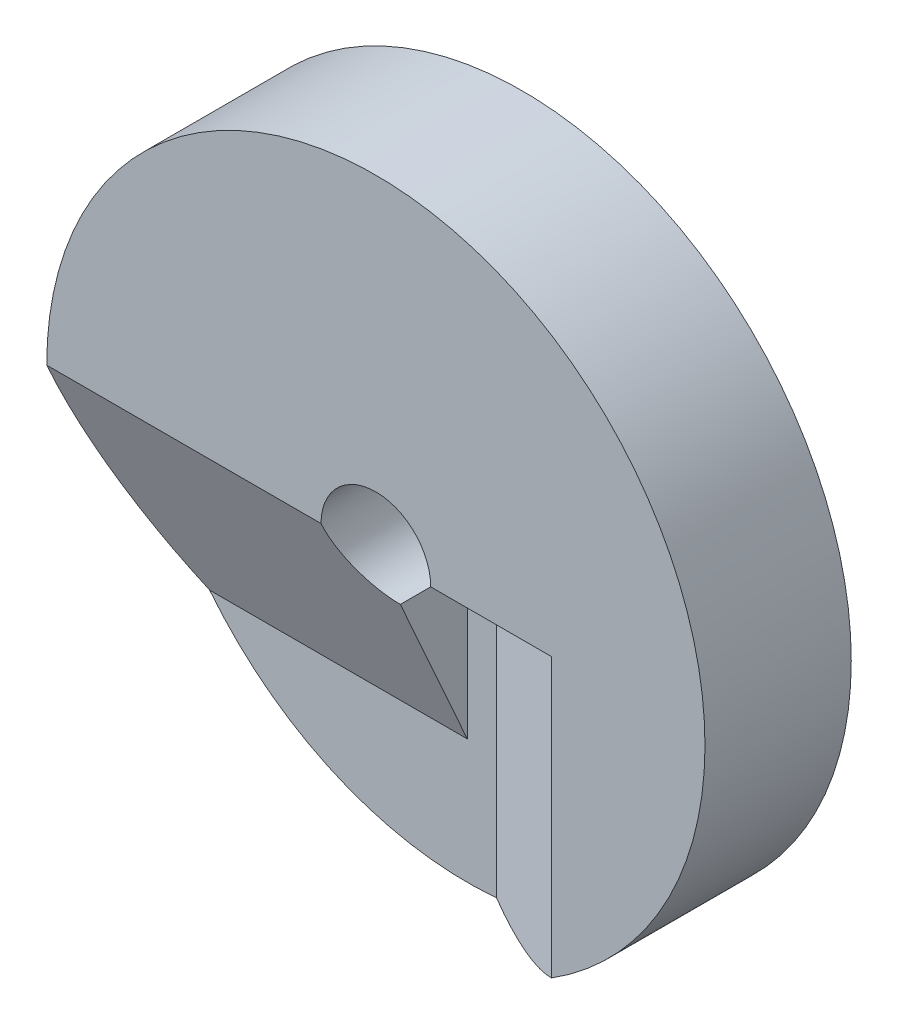
ISO-10303-21;
HEADER;
FILE_DESCRIPTION(('STEP AP214'),'2;1');
FILE_NAME('part.step','',(''),(''),'','','');
FILE_SCHEMA(('AUTOMOTIVE_DESIGN { 1 0 10303 214 1 1 1 1 }'));
ENDSEC;
DATA;
#1=APPLICATION_CONTEXT('core data for automotive mechanical design processes');
#2=APPLICATION_PROTOCOL_DEFINITION('international standard','automotive_design',2000,#1);
#3=PRODUCT_CONTEXT('',#1,'mechanical');
#4=PRODUCT('Part','Part','',(#3));
#5=PRODUCT_RELATED_PRODUCT_CATEGORY('part','',(#4));
#6=PRODUCT_DEFINITION_FORMATION('','',#4);
#7=PRODUCT_DEFINITION_CONTEXT('part definition',#1,'design');
#8=PRODUCT_DEFINITION('design','',#6,#7);
#9=PRODUCT_DEFINITION_SHAPE('','',#8);
#10=(LENGTH_UNIT() NAMED_UNIT(*) SI_UNIT(.MILLI.,.METRE.));
#11=(NAMED_UNIT(*) PLANE_ANGLE_UNIT() SI_UNIT($,.RADIAN.));
#12=(NAMED_UNIT(*) SI_UNIT($,.STERADIAN.) SOLID_ANGLE_UNIT());
#13=UNCERTAINTY_MEASURE_WITH_UNIT(LENGTH_MEASURE(1.E-05),#10,'distance_accuracy_value','');
#14=(GEOMETRIC_REPRESENTATION_CONTEXT(3) GLOBAL_UNCERTAINTY_ASSIGNED_CONTEXT((#13)) GLOBAL_UNIT_ASSIGNED_CONTEXT((#10,
#11,#12)) REPRESENTATION_CONTEXT('',''));
#15=CARTESIAN_POINT('',(0.,0.,0.));
#16=DIRECTION('',(0.,0.,1.));
#17=DIRECTION('',(1.,0.,0.));
#18=AXIS2_PLACEMENT_3D('',#15,#16,#17);
#19=CARTESIAN_POINT('',(0.,0.,4.));
#20=DIRECTION('',(0.,0.,1.));
#21=DIRECTION('',(1.,0.,0.));
#22=AXIS2_PLACEMENT_3D('',#19,#20,#21);
#23=PLANE('',#22);
#24=DIRECTION('',(-1.,0.,0.));
#25=VECTOR('',#24,1.);
#26=CARTESIAN_POINT('',(0.,0.,4.));
#27=LINE('',#26,#25);
#28=CARTESIAN_POINT('',(4.80347796201386,0.,4.));
#29=VERTEX_POINT('',#28);
#30=CARTESIAN_POINT('',(1.5,0.,4.));
#31=VERTEX_POINT('',#30);
#32=EDGE_CURVE('E100',#29,#31,#27,.T.);
#33=ORIENTED_EDGE('',*,*,#32,.F.);
#34=DIRECTION('',(0.,1.,0.));
#35=VECTOR('',#34,1.);
#36=CARTESIAN_POINT('',(4.80347796201386,-10.,4.));
#37=LINE('',#36,#35);
#38=CARTESIAN_POINT('',(4.80347796201386,-7.61095259927739,4.));
#39=VERTEX_POINT('',#38);
#40=EDGE_CURVE('E104',#39,#29,#37,.T.);
#41=ORIENTED_EDGE('',*,*,#40,.F.);
#42=CARTESIAN_POINT('',(0.,0.,4.));
#43=DIRECTION('',(0.,0.,1.));
#44=DIRECTION('',(1.,0.,0.));
#45=AXIS2_PLACEMENT_3D('',#42,#43,#44);
#46=CIRCLE('',#45,9.);
#47=CARTESIAN_POINT('',(-9.00000000000001,0.,4.));
#48=VERTEX_POINT('',#47);
#49=EDGE_CURVE('E63',#39,#48,#46,.T.);
#50=ORIENTED_EDGE('',*,*,#49,.T.);
#51=DIRECTION('',(1.,0.,0.));
#52=VECTOR('',#51,1.);
#53=CARTESIAN_POINT('',(-15.,0.,4.));
#54=LINE('',#53,#52);
#55=CARTESIAN_POINT('',(-1.5,0.,4.));
#56=VERTEX_POINT('',#55);
#57=EDGE_CURVE('E137',#48,#56,#54,.T.);
#58=ORIENTED_EDGE('',*,*,#57,.T.);
#59=CARTESIAN_POINT('',(0.,0.,4.));
#60=DIRECTION('',(0.,0.,1.));
#61=DIRECTION('',(1.,0.,0.));
#62=AXIS2_PLACEMENT_3D('',#59,#60,#61);
#63=CIRCLE('',#62,1.5);
#64=EDGE_CURVE('E55',#31,#56,#63,.T.);
#65=ORIENTED_EDGE('',*,*,#64,.F.);
#66=EDGE_LOOP('',(#33,#41,#50,#58,#65));
#67=FACE_BOUND('',#66,.T.);
#68=ADVANCED_FACE('F39',(#67),#23,.T.);
#69=CARTESIAN_POINT('',(0.,0.,4.));
#70=DIRECTION('',(0.,0.,-1.));
#71=DIRECTION('',(-1.,0.,0.));
#72=AXIS2_PLACEMENT_3D('',#69,#70,#71);
#73=CYLINDRICAL_SURFACE('',#72,9.);
#74=CARTESIAN_POINT('',(0.,0.,0.));
#75=DIRECTION('',(0.,0.,1.));
#76=DIRECTION('',(1.,0.,0.));
#77=AXIS2_PLACEMENT_3D('',#74,#75,#76);
#78=CIRCLE('',#77,9.);
#79=CARTESIAN_POINT('',(9.,0.,0.));
#80=VERTEX_POINT('',#79);
#81=EDGE_CURVE('E149',#80,#80,#78,.T.);
#82=ORIENTED_EDGE('',*,*,#81,.T.);
#83=EDGE_LOOP('',(#82));
#84=FACE_BOUND('',#83,.T.);
#85=CARTESIAN_POINT('',(0.,0.,1.00177341070646));
#86=DIRECTION('',(-0.529497577433141,0.,0.848311449582307));
#87=DIRECTION('',(-0.848311449582307,0.,-0.529497577433141));
#88=AXIS2_PLACEMENT_3D('',#85,#86,#87);
#89=ELLIPSE('',#88,10.6093110076864,9.);
#90=CARTESIAN_POINT('',(0.798211999822452,-8.9645333176546,1.5));
#91=VERTEX_POINT('',#90);
#92=EDGE_CURVE('E108',#91,#39,#89,.T.);
#93=ORIENTED_EDGE('',*,*,#92,.F.);
#94=CARTESIAN_POINT('',(0.,0.,1.5));
#95=DIRECTION('',(0.,0.,1.));
#96=DIRECTION('',(0.,-1.,0.));
#97=AXIS2_PLACEMENT_3D('',#94,#95,#96);
#98=CIRCLE('',#97,9.);
#99=CARTESIAN_POINT('',(-7.04556598152342,-5.6,1.5));
#100=VERTEX_POINT('',#99);
#101=EDGE_CURVE('E161',#100,#91,#98,.T.);
#102=ORIENTED_EDGE('',*,*,#101,.F.);
#103=CARTESIAN_POINT('',(0.,0.,4.));
#104=DIRECTION('',(0.,-0.407650840373889,0.913137882437511));
#105=DIRECTION('',(0.,-0.913137882437511,-0.407650840373889));
#106=AXIS2_PLACEMENT_3D('',#103,#104,#105);
#107=ELLIPSE('',#106,9.85612378272555,9.);
#108=EDGE_CURVE('E140',#48,#100,#107,.T.);
#109=ORIENTED_EDGE('',*,*,#108,.F.);
#110=ORIENTED_EDGE('',*,*,#49,.F.);
#111=EDGE_LOOP('',(#93,#102,#109,#110));
#112=FACE_BOUND('',#111,.T.);
#113=ADVANCED_FACE('F41',(#84,#112),#73,.T.);
#114=CARTESIAN_POINT('',(0.,0.,4.));
#115=DIRECTION('',(0.,0.,-1.));
#116=DIRECTION('',(-1.,0.,0.));
#117=AXIS2_PLACEMENT_3D('',#114,#115,#116);
#118=CYLINDRICAL_SURFACE('',#117,1.5);
#119=CARTESIAN_POINT('',(0.,0.,0.));
#120=DIRECTION('',(0.,0.,1.));
#121=DIRECTION('',(1.,0.,0.));
#122=AXIS2_PLACEMENT_3D('',#119,#120,#121);
#123=CIRCLE('',#122,1.5);
#124=CARTESIAN_POINT('',(1.5,0.,0.));
#125=VERTEX_POINT('',#124);
#126=EDGE_CURVE('E146',#125,#125,#123,.T.);
#127=ORIENTED_EDGE('',*,*,#126,.F.);
#128=EDGE_LOOP('',(#127));
#129=FACE_BOUND('',#128,.T.);
#130=CARTESIAN_POINT('',(0.,0.,4.));
#131=DIRECTION('',(0.,-0.407650840373889,0.913137882437511));
#132=DIRECTION('',(0.,-0.913137882437511,-0.407650840373889));
#133=AXIS2_PLACEMENT_3D('',#130,#131,#132);
#134=ELLIPSE('',#133,1.64268729712092,1.5);
#135=CARTESIAN_POINT('',(0.,-1.5,3.33035714285714));
#136=VERTEX_POINT('',#135);
#137=EDGE_CURVE('E155',#56,#136,#134,.T.);
#138=ORIENTED_EDGE('',*,*,#137,.T.);
#139=DIRECTION('',(0.,0.,-1.));
#140=VECTOR('',#139,1.);
#141=CARTESIAN_POINT('',(0.,-1.5,4.));
#142=LINE('',#141,#140);
#143=CARTESIAN_POINT('',(0.,-1.5,1.5));
#144=VERTEX_POINT('',#143);
#145=EDGE_CURVE('E126',#136,#144,#142,.T.);
#146=ORIENTED_EDGE('',*,*,#145,.T.);
#147=CARTESIAN_POINT('',(0.,0.,1.5));
#148=DIRECTION('',(0.,0.,1.));
#149=DIRECTION('',(1.,0.,0.));
#150=AXIS2_PLACEMENT_3D('',#147,#148,#149);
#151=CIRCLE('',#150,1.5);
#152=CARTESIAN_POINT('',(0.798211999822452,-1.26998330829167,1.5));
#153=VERTEX_POINT('',#152);
#154=EDGE_CURVE('E110',#144,#153,#151,.T.);
#155=ORIENTED_EDGE('',*,*,#154,.T.);
#156=CARTESIAN_POINT('',(0.,0.,1.00177341070646));
#157=DIRECTION('',(-0.529497577433141,0.,0.848311449582307));
#158=DIRECTION('',(-0.848311449582307,0.,-0.529497577433141));
#159=AXIS2_PLACEMENT_3D('',#156,#157,#158);
#160=ELLIPSE('',#159,1.76821850128107,1.5);
#161=CARTESIAN_POINT('',(1.5,0.,1.93804082350725));
#162=VERTEX_POINT('',#161);
#163=EDGE_CURVE('E11',#153,#162,#160,.T.);
#164=ORIENTED_EDGE('',*,*,#163,.T.);
#165=DIRECTION('',(0.,0.,-1.));
#166=VECTOR('',#165,1.);
#167=CARTESIAN_POINT('',(1.5,0.,4.));
#168=LINE('',#167,#166);
#169=EDGE_CURVE('E48',#31,#162,#168,.T.);
#170=ORIENTED_EDGE('',*,*,#169,.F.);
#171=ORIENTED_EDGE('',*,*,#64,.T.);
#172=EDGE_LOOP('',(#138,#146,#155,#164,#170,#171));
#173=FACE_BOUND('',#172,.T.);
#174=ADVANCED_FACE('F173',(#129,#173),#118,.F.);
#175=CARTESIAN_POINT('',(0.,0.,0.));
#176=DIRECTION('',(0.,0.,1.));
#177=DIRECTION('',(1.,0.,0.));
#178=AXIS2_PLACEMENT_3D('',#175,#176,#177);
#179=PLANE('',#178);
#180=ORIENTED_EDGE('',*,*,#81,.F.);
#181=EDGE_LOOP('',(#180));
#182=FACE_BOUND('',#181,.T.);
#183=ORIENTED_EDGE('',*,*,#126,.T.);
#184=EDGE_LOOP('',(#183));
#185=FACE_BOUND('',#184,.T.);
#186=ADVANCED_FACE('F192',(#182,#185),#179,.F.);
#187=CARTESIAN_POINT('',(-15.,0.,1.5));
#188=DIRECTION('',(0.,0.,1.));
#189=DIRECTION('',(0.,-1.,0.));
#190=AXIS2_PLACEMENT_3D('',#187,#188,#189);
#191=PLANE('',#190);
#192=ORIENTED_EDGE('',*,*,#101,.T.);
#193=DIRECTION('',(0.,1.,0.));
#194=VECTOR('',#193,1.);
#195=CARTESIAN_POINT('',(0.798211999822452,-10.,1.5));
#196=LINE('',#195,#194);
#197=EDGE_CURVE('E114',#91,#153,#196,.T.);
#198=ORIENTED_EDGE('',*,*,#197,.T.);
#199=ORIENTED_EDGE('',*,*,#154,.F.);
#200=DIRECTION('',(0.,1.,0.));
#201=VECTOR('',#200,1.);
#202=CARTESIAN_POINT('',(0.,-10.,1.5));
#203=LINE('',#202,#201);
#204=CARTESIAN_POINT('',(0.,-5.6,1.5));
#205=VERTEX_POINT('',#204);
#206=EDGE_CURVE('E111',#205,#144,#203,.T.);
#207=ORIENTED_EDGE('',*,*,#206,.F.);
#208=DIRECTION('',(1.,0.,0.));
#209=VECTOR('',#208,1.);
#210=CARTESIAN_POINT('',(-15.,-5.6,1.5));
#211=LINE('',#210,#209);
#212=EDGE_CURVE('E136',#100,#205,#211,.T.);
#213=ORIENTED_EDGE('',*,*,#212,.F.);
#214=EDGE_LOOP('',(#192,#198,#199,#207,#213));
#215=FACE_BOUND('',#214,.T.);
#216=ADVANCED_FACE('F167',(#215),#191,.T.);
#217=CARTESIAN_POINT('',(-15.,-1.48896570061154,3.33528316936985));
#218=DIRECTION('',(0.,-0.407650840373889,0.913137882437511));
#219=DIRECTION('',(0.,-0.913137882437511,-0.407650840373889));
#220=AXIS2_PLACEMENT_3D('',#217,#218,#219);
#221=PLANE('',#220);
#222=ORIENTED_EDGE('',*,*,#108,.T.);
#223=ORIENTED_EDGE('',*,*,#212,.T.);
#224=DIRECTION('',(0.,-0.913137882437511,-0.407650840373889));
#225=VECTOR('',#224,1.);
#226=CARTESIAN_POINT('',(0.,-1.48896570061154,3.33528316936985));
#227=LINE('',#226,#225);
#228=EDGE_CURVE('E132',#136,#205,#227,.T.);
#229=ORIENTED_EDGE('',*,*,#228,.F.);
#230=ORIENTED_EDGE('',*,*,#137,.F.);
#231=ORIENTED_EDGE('',*,*,#57,.F.);
#232=EDGE_LOOP('',(#222,#223,#229,#230,#231));
#233=FACE_BOUND('',#232,.T.);
#234=ADVANCED_FACE('F171',(#233),#221,.T.);
#235=CARTESIAN_POINT('',(-0.449975436057567,-10.,0.720908519145444));
#236=DIRECTION('',(-0.529497577433141,0.,0.848311449582307));
#237=DIRECTION('',(0.848311449582307,0.,0.529497577433141));
#238=AXIS2_PLACEMENT_3D('',#235,#236,#237);
#239=PLANE('',#238);
#240=ORIENTED_EDGE('',*,*,#92,.T.);
#241=ORIENTED_EDGE('',*,*,#40,.T.);
#242=DIRECTION('',(0.848311449582307,0.,0.529497577433141));
#243=VECTOR('',#242,1.);
#244=CARTESIAN_POINT('',(-0.449975436057567,0.,0.720908519145444));
#245=LINE('',#244,#243);
#246=EDGE_CURVE('E96',#162,#29,#245,.T.);
#247=ORIENTED_EDGE('',*,*,#246,.F.);
#248=ORIENTED_EDGE('',*,*,#163,.F.);
#249=ORIENTED_EDGE('',*,*,#197,.F.);
#250=EDGE_LOOP('',(#240,#241,#247,#248,#249));
#251=FACE_BOUND('',#250,.T.);
#252=ADVANCED_FACE('F105',(#251),#239,.T.);
#253=CARTESIAN_POINT('',(0.,-10.,0.));
#254=DIRECTION('',(1.,0.,0.));
#255=DIRECTION('',(0.,0.,-1.));
#256=AXIS2_PLACEMENT_3D('',#253,#254,#255);
#257=PLANE('',#256);
#258=ORIENTED_EDGE('',*,*,#228,.T.);
#259=ORIENTED_EDGE('',*,*,#206,.T.);
#260=ORIENTED_EDGE('',*,*,#145,.F.);
#261=EDGE_LOOP('',(#258,#259,#260));
#262=FACE_BOUND('',#261,.T.);
#263=ADVANCED_FACE('F175',(#262),#257,.T.);
#264=CARTESIAN_POINT('',(0.,0.,0.));
#265=DIRECTION('',(0.,1.,0.));
#266=DIRECTION('',(0.,0.,1.));
#267=AXIS2_PLACEMENT_3D('',#264,#265,#266);
#268=PLANE('',#267);
#269=ORIENTED_EDGE('',*,*,#169,.T.);
#270=ORIENTED_EDGE('',*,*,#246,.T.);
#271=ORIENTED_EDGE('',*,*,#32,.T.);
#272=EDGE_LOOP('',(#269,#270,#271));
#273=FACE_BOUND('',#272,.T.);
#274=ADVANCED_FACE('F98',(#273),#268,.F.);
#275=CLOSED_SHELL('',(#68,#113,#174,#186,#216,#234,#252,#263,#274));
#276=MANIFOLD_SOLID_BREP('B2',#275);
#277=ADVANCED_BREP_SHAPE_REPRESENTATION('',(#18,#276),#14);
#278=SHAPE_DEFINITION_REPRESENTATION(#9,#277);
ENDSEC;
END-ISO-10303-21;
